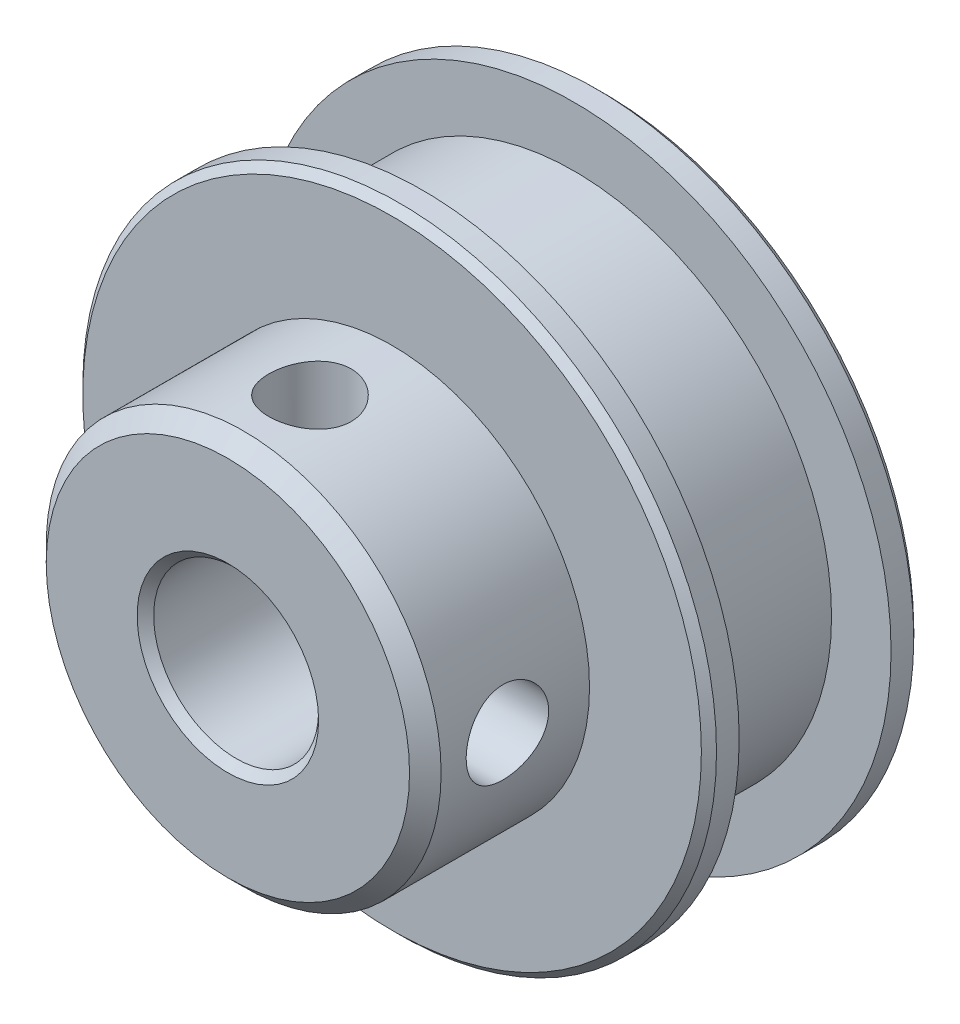
ISO-10303-21;
HEADER;
FILE_DESCRIPTION(('STEP AP214'),'2;1');
FILE_NAME('part.step','',(''),(''),'','','');
FILE_SCHEMA(('AUTOMOTIVE_DESIGN { 1 0 10303 214 1 1 1 1 }'));
ENDSEC;
DATA;
#1=APPLICATION_CONTEXT('core data for automotive mechanical design processes');
#2=APPLICATION_PROTOCOL_DEFINITION('international standard','automotive_design',2000,#1);
#3=PRODUCT_CONTEXT('',#1,'mechanical');
#4=PRODUCT('Part','Part','',(#3));
#5=PRODUCT_RELATED_PRODUCT_CATEGORY('part','',(#4));
#6=PRODUCT_DEFINITION_FORMATION('','',#4);
#7=PRODUCT_DEFINITION_CONTEXT('part definition',#1,'design');
#8=PRODUCT_DEFINITION('design','',#6,#7);
#9=PRODUCT_DEFINITION_SHAPE('','',#8);
#10=(LENGTH_UNIT() NAMED_UNIT(*) SI_UNIT(.MILLI.,.METRE.));
#11=(NAMED_UNIT(*) PLANE_ANGLE_UNIT() SI_UNIT($,.RADIAN.));
#12=(NAMED_UNIT(*) SI_UNIT($,.STERADIAN.) SOLID_ANGLE_UNIT());
#13=UNCERTAINTY_MEASURE_WITH_UNIT(LENGTH_MEASURE(1.E-05),#10,'distance_accuracy_value','');
#14=(GEOMETRIC_REPRESENTATION_CONTEXT(3) GLOBAL_UNCERTAINTY_ASSIGNED_CONTEXT((#13)) GLOBAL_UNIT_ASSIGNED_CONTEXT((#10,
#11,#12)) REPRESENTATION_CONTEXT('',''));
#15=CARTESIAN_POINT('',(0.,0.,0.));
#16=DIRECTION('',(0.,0.,1.));
#17=DIRECTION('',(1.,0.,0.));
#18=AXIS2_PLACEMENT_3D('',#15,#16,#17);
#19=CARTESIAN_POINT('',(0.,0.,8.833));
#20=DIRECTION('',(0.,0.,1.));
#21=DIRECTION('',(1.,0.,0.));
#22=AXIS2_PLACEMENT_3D('',#19,#20,#21);
#23=CYLINDRICAL_SURFACE('',#22,15.367);
#24=CARTESIAN_POINT('',(0.,0.,8.833));
#25=DIRECTION('',(0.,0.,1.));
#26=DIRECTION('',(1.,0.,0.));
#27=AXIS2_PLACEMENT_3D('',#24,#25,#26);
#28=CIRCLE('',#27,15.367);
#29=CARTESIAN_POINT('',(15.367,0.,8.833));
#30=VERTEX_POINT('',#29);
#31=EDGE_CURVE('E242',#30,#30,#28,.T.);
#32=ORIENTED_EDGE('',*,*,#31,.T.);
#33=DIRECTION('',(0.,0.,1.));
#34=VECTOR('',#33,1.);
#35=CARTESIAN_POINT('',(15.367,0.,8.833));
#36=LINE('',#35,#34);
#37=CARTESIAN_POINT('',(15.367,0.,9.93325));
#38=VERTEX_POINT('',#37);
#39=EDGE_CURVE('E11',#30,#38,#36,.T.);
#40=ORIENTED_EDGE('',*,*,#39,.T.);
#41=CARTESIAN_POINT('',(0.,0.,9.93325));
#42=DIRECTION('',(0.,0.,1.));
#43=DIRECTION('',(1.,0.,0.));
#44=AXIS2_PLACEMENT_3D('',#41,#42,#43);
#45=CIRCLE('',#44,15.367);
#46=EDGE_CURVE('E234',#38,#38,#45,.T.);
#47=ORIENTED_EDGE('',*,*,#46,.F.);
#48=ORIENTED_EDGE('',*,*,#39,.F.);
#49=EDGE_LOOP('',(#32,#40,#47,#48));
#50=FACE_BOUND('',#49,.T.);
#51=ADVANCED_FACE('F17',(#50),#23,.T.);
#52=CARTESIAN_POINT('',(0.,0.,9.93325));
#53=DIRECTION('',(0.,0.,-1.));
#54=DIRECTION('',(1.,0.,0.));
#55=AXIS2_PLACEMENT_3D('',#52,#53,#54);
#56=CONICAL_SURFACE('',#55,15.367,0.785398163397);
#57=ORIENTED_EDGE('',*,*,#46,.T.);
#58=DIRECTION('',(-0.707106781186548,0.,0.707106781186548));
#59=VECTOR('',#58,1.);
#60=CARTESIAN_POINT('',(15.367,0.,9.93325));
#61=LINE('',#60,#59);
#62=CARTESIAN_POINT('',(15.00025,0.,10.3));
#63=VERTEX_POINT('',#62);
#64=EDGE_CURVE('E25',#38,#63,#61,.T.);
#65=ORIENTED_EDGE('',*,*,#64,.T.);
#66=CARTESIAN_POINT('',(0.,0.,10.3));
#67=DIRECTION('',(0.,0.,1.));
#68=DIRECTION('',(1.,0.,0.));
#69=AXIS2_PLACEMENT_3D('',#66,#67,#68);
#70=CIRCLE('',#69,15.00025);
#71=EDGE_CURVE('E263',#63,#63,#70,.T.);
#72=ORIENTED_EDGE('',*,*,#71,.F.);
#73=ORIENTED_EDGE('',*,*,#64,.F.);
#74=EDGE_LOOP('',(#57,#65,#72,#73));
#75=FACE_BOUND('',#74,.T.);
#76=ADVANCED_FACE('F274',(#75),#56,.T.);
#77=CARTESIAN_POINT('',(0.,0.,8.833));
#78=DIRECTION('',(0.,0.,1.));
#79=DIRECTION('',(1.,0.,0.));
#80=AXIS2_PLACEMENT_3D('',#77,#78,#79);
#81=PLANE('',#80);
#82=ORIENTED_EDGE('',*,*,#31,.F.);
#83=EDGE_LOOP('',(#82));
#84=FACE_BOUND('',#83,.T.);
#85=CARTESIAN_POINT('',(0.,0.,8.833));
#86=DIRECTION('',(0.,0.,1.));
#87=DIRECTION('',(1.,0.,0.));
#88=AXIS2_PLACEMENT_3D('',#85,#86,#87);
#89=CIRCLE('',#88,12.48);
#90=CARTESIAN_POINT('',(12.48,0.,8.833));
#91=VERTEX_POINT('',#90);
#92=EDGE_CURVE('E257',#91,#91,#89,.T.);
#93=ORIENTED_EDGE('',*,*,#92,.T.);
#94=EDGE_LOOP('',(#93));
#95=FACE_BOUND('',#94,.T.);
#96=ADVANCED_FACE('F270',(#84,#95),#81,.F.);
#97=CARTESIAN_POINT('',(0.,0.,10.3));
#98=DIRECTION('',(0.,0.,1.));
#99=DIRECTION('',(1.,0.,0.));
#100=AXIS2_PLACEMENT_3D('',#97,#98,#99);
#101=PLANE('',#100);
#102=CARTESIAN_POINT('',(0.,0.,10.3));
#103=DIRECTION('',(0.,0.,1.));
#104=DIRECTION('',(1.,0.,0.));
#105=AXIS2_PLACEMENT_3D('',#102,#103,#104);
#106=CIRCLE('',#105,9.5758);
#107=CARTESIAN_POINT('',(9.5758,0.,10.3));
#108=VERTEX_POINT('',#107);
#109=EDGE_CURVE('E228',#108,#108,#106,.T.);
#110=ORIENTED_EDGE('',*,*,#109,.F.);
#111=EDGE_LOOP('',(#110));
#112=FACE_BOUND('',#111,.T.);
#113=ORIENTED_EDGE('',*,*,#71,.T.);
#114=EDGE_LOOP('',(#113));
#115=FACE_BOUND('',#114,.T.);
#116=ADVANCED_FACE('F273',(#112,#115),#101,.T.);
#117=CARTESIAN_POINT('',(0.,0.,17.496536));
#118=DIRECTION('',(0.,0.,-1.));
#119=DIRECTION('',(1.,0.,0.));
#120=AXIS2_PLACEMENT_3D('',#117,#118,#119);
#121=CONICAL_SURFACE('',#120,9.5758,0.785398163397);
#122=CARTESIAN_POINT('',(0.,0.,17.496536));
#123=DIRECTION('',(0.,0.,1.));
#124=DIRECTION('',(1.,0.,0.));
#125=AXIS2_PLACEMENT_3D('',#122,#123,#124);
#126=CIRCLE('',#125,9.5758);
#127=CARTESIAN_POINT('',(9.5758,0.,17.496536));
#128=VERTEX_POINT('',#127);
#129=EDGE_CURVE('E249',#128,#128,#126,.T.);
#130=ORIENTED_EDGE('',*,*,#129,.T.);
#131=DIRECTION('',(-0.707106781186548,0.,0.707106781186548));
#132=VECTOR('',#131,1.);
#133=CARTESIAN_POINT('',(9.5758,0.,17.496536));
#134=LINE('',#133,#132);
#135=CARTESIAN_POINT('',(8.809736,0.,18.2626));
#136=VERTEX_POINT('',#135);
#137=EDGE_CURVE('E260',#128,#136,#134,.T.);
#138=ORIENTED_EDGE('',*,*,#137,.T.);
#139=CARTESIAN_POINT('',(0.,0.,18.2626));
#140=DIRECTION('',(0.,0.,1.));
#141=DIRECTION('',(1.,0.,0.));
#142=AXIS2_PLACEMENT_3D('',#139,#140,#141);
#143=CIRCLE('',#142,8.809736);
#144=EDGE_CURVE('E221',#136,#136,#143,.T.);
#145=ORIENTED_EDGE('',*,*,#144,.F.);
#146=ORIENTED_EDGE('',*,*,#137,.F.);
#147=EDGE_LOOP('',(#130,#138,#145,#146));
#148=FACE_BOUND('',#147,.T.);
#149=ADVANCED_FACE('F322',(#148),#121,.T.);
#150=CARTESIAN_POINT('',(0.,0.,1.467));
#151=DIRECTION('',(0.,0.,1.));
#152=DIRECTION('',(1.,0.,0.));
#153=AXIS2_PLACEMENT_3D('',#150,#151,#152);
#154=CYLINDRICAL_SURFACE('',#153,12.48);
#155=CARTESIAN_POINT('',(0.,0.,1.467));
#156=DIRECTION('',(0.,0.,1.));
#157=DIRECTION('',(1.,0.,0.));
#158=AXIS2_PLACEMENT_3D('',#155,#156,#157);
#159=CIRCLE('',#158,12.48);
#160=CARTESIAN_POINT('',(12.48,0.,1.467));
#161=VERTEX_POINT('',#160);
#162=EDGE_CURVE('E220',#161,#161,#159,.T.);
#163=ORIENTED_EDGE('',*,*,#162,.T.);
#164=DIRECTION('',(0.,0.,1.));
#165=VECTOR('',#164,1.);
#166=CARTESIAN_POINT('',(12.48,0.,1.467));
#167=LINE('',#166,#165);
#168=EDGE_CURVE('E253',#161,#91,#167,.T.);
#169=ORIENTED_EDGE('',*,*,#168,.T.);
#170=ORIENTED_EDGE('',*,*,#92,.F.);
#171=ORIENTED_EDGE('',*,*,#168,.F.);
#172=EDGE_LOOP('',(#163,#169,#170,#171));
#173=FACE_BOUND('',#172,.T.);
#174=ADVANCED_FACE('F278',(#173),#154,.T.);
#175=CARTESIAN_POINT('',(0.,0.,10.3));
#176=DIRECTION('',(0.,0.,1.));
#177=DIRECTION('',(1.,0.,0.));
#178=AXIS2_PLACEMENT_3D('',#175,#176,#177);
#179=CYLINDRICAL_SURFACE('',#178,9.5758);
#180=CARTESIAN_POINT('',(0.,9.5758,12.2813));
#181=CARTESIAN_POINT('',(-0.222799582031,9.5758,12.2813));
#182=CARTESIAN_POINT('',(-0.440768386329,9.569875379982,12.309665240298));
#183=CARTESIAN_POINT('',(-0.649799063763,9.558476977118,12.364244769283));
#184=CARTESIAN_POINT('',(-0.8462920697,9.542628469812,12.442271710147));
#185=CARTESIAN_POINT('',(-1.027225131083,9.523770897491,12.540367485175));
#186=CARTESIAN_POINT('',(-1.190276780029,9.503495247159,12.654543949357));
#187=CARTESIAN_POINT('',(-1.333986903029,9.483256448378,12.780212069891));
#188=CARTESIAN_POINT('',(-1.596661351703,9.442791919154,13.059931946946));
#189=CARTESIAN_POINT('',(-1.713896650379,9.422352957718,13.219055245055));
#190=CARTESIAN_POINT('',(-1.810313107623,9.404010644275,13.386503800854));
#191=CARTESIAN_POINT('',(-1.88660848886,9.388605245969,13.559948355919));
#192=CARTESIAN_POINT('',(-1.943392718326,9.376701043776,13.737561914356));
#193=CARTESIAN_POINT('',(-1.981113549325,9.368644898065,13.917845794328));
#194=CARTESIAN_POINT('',(-2.,9.364611344845,14.099498022237));
#195=CARTESIAN_POINT('',(-2.,9.364611344845,14.490853717853));
#196=CARTESIAN_POINT('',(-1.974906749921,9.369970270036,14.700093830439));
#197=CARTESIAN_POINT('',(-1.924853283166,9.38066109943,14.907246828775));
#198=CARTESIAN_POINT('',(-1.849392248764,9.396382333324,15.110392582594));
#199=CARTESIAN_POINT('',(-1.747706921418,9.416534854692,15.307134581692));
#200=CARTESIAN_POINT('',(-1.61873582315,9.440099920173,15.494380669891));
#201=CARTESIAN_POINT('',(-1.461365747784,9.465504339452,15.668025568423));
#202=CARTESIAN_POINT('',(-1.114354083291,9.512117729023,15.955098583383));
#203=CARTESIAN_POINT('',(-0.926111267086,9.534246170264,16.078651132275));
#204=CARTESIAN_POINT('',(-0.712981476369,9.554677909884,16.18222517426));
#205=CARTESIAN_POINT('',(-0.480193420986,9.57071567047,16.257883990361));
#206=CARTESIAN_POINT('',(-0.23480163296,9.579953784376,16.30042852994));
#207=CARTESIAN_POINT('',(0.01524822468509,9.581300303878,16.307357648552));
#208=CARTESIAN_POINT('',(0.2618049719,9.57512660024,16.278951651124));
#209=CARTESIAN_POINT('',(0.649534750578,9.554960178517,16.179399564344));
#210=CARTESIAN_POINT('',(0.798173532434,9.544455004682,16.126676302594));
#211=CARTESIAN_POINT('',(0.941862845121,9.531648124133,16.060670317993));
#212=CARTESIAN_POINT('',(1.079233883701,9.516962285975,15.981925298476));
#213=CARTESIAN_POINT('',(1.20898793161,9.500931446326,15.891152738601));
#214=CARTESIAN_POINT('',(1.329912557943,9.484167148977,15.789225918672));
#215=CARTESIAN_POINT('',(1.440908393497,9.467313175871,15.677169963311));
#216=CARTESIAN_POINT('',(1.651144195955,9.433033275846,15.423038533517));
#217=CARTESIAN_POINT('',(1.748163490926,9.415708997772,15.279008245092));
#218=CARTESIAN_POINT('',(1.830769630029,9.399843108599,15.125610966288));
#219=CARTESIAN_POINT('',(1.897916002975,9.386231465582,14.964562889729));
#220=CARTESIAN_POINT('',(1.948815082687,9.375543545123,14.797691498313));
#221=CARTESIAN_POINT('',(1.982934751428,9.368255544049,14.626894887714));
#222=CARTESIAN_POINT('',(2.,9.364611344845,14.45411146166));
#223=CARTESIAN_POINT('',(2.,9.364611344845,14.099485982914));
#224=CARTESIAN_POINT('',(1.981111088062,9.36864541956,13.917832988332));
#225=CARTESIAN_POINT('',(1.943389266063,9.376701788903,13.737554129382));
#226=CARTESIAN_POINT('',(1.886606467916,9.388605615228,13.559946797144));
#227=CARTESIAN_POINT('',(1.810313770096,9.404010442461,13.386506441793));
#228=CARTESIAN_POINT('',(1.713899091017,9.422352521661,13.219058759581));
#229=CARTESIAN_POINT('',(1.596663124779,9.442791646015,13.05993383508));
#230=CARTESIAN_POINT('',(1.334032533458,9.483249419092,12.780260661363));
#231=CARTESIAN_POINT('',(1.190324781185,9.503489248097,12.654574889307));
#232=CARTESIAN_POINT('',(1.027237950305,9.523771179125,12.540360261473));
#233=CARTESIAN_POINT('',(0.846248487641,9.542635253176,12.442235409038));
#234=CARTESIAN_POINT('',(0.649701058963,9.558485760664,12.36420277693));
#235=CARTESIAN_POINT('',(0.440644250681,9.569880542629,12.309640504288));
#236=CARTESIAN_POINT('',(0.222702436913,9.5758,12.2813));
#237=CARTESIAN_POINT('',(0.,9.5758,12.2813));
#238=(BOUNDED_CURVE() B_SPLINE_CURVE(8,(#180,#181,#182,#183,#184,#185,#186,#187,#188,#189,#190,
#191,#192,#193,#194,#195,#196,#197,#198,#199,#200,#201,#202,#203,#204,#205,#206,#207,#208,#209,
#210,#211,#212,#213,#214,#215,#216,#217,#218,#219,#220,#221,#222,#223,#224,#225,#226,#227,#228,
#229,#230,#231,#232,#233,#234,#235,#236,#237),.UNSPECIFIED.,.T.,
.F.) B_SPLINE_CURVE_WITH_KNOTS((9,7,7,7,7,7,7,7,9),(0.,0.1316574941,0.279007353917,
0.448849900899,0.594995184306,0.689388692849,0.793210058442,0.90243996343,1.),
.UNSPECIFIED.) CURVE() GEOMETRIC_REPRESENTATION_ITEM() RATIONAL_B_SPLINE_CURVE((1.,1.,1.,1.,1.,
1.,1.,1.,1.,1.,1.,1.,1.,1.,1.,1.,1.,1.,1.,1.,1.,1.,1.,1.,1.,1.,1.,1.,1.,1.,1.,1.,1.,1.,1.,1.,1.,
1.,1.,1.,1.,1.,1.,1.,1.,1.,1.,1.,1.,1.,1.,1.,1.,1.,1.,1.,1.,1.)) REPRESENTATION_ITEM(''));
#239=CARTESIAN_POINT('',(0.,9.5758,12.2813));
#240=VERTEX_POINT('',#239);
#241=EDGE_CURVE('E215',#240,#240,#238,.T.);
#242=ORIENTED_EDGE('',*,*,#241,.F.);
#243=EDGE_LOOP('',(#242));
#244=FACE_BOUND('',#243,.T.);
#245=ORIENTED_EDGE('',*,*,#109,.T.);
#246=DIRECTION('',(0.,0.,1.));
#247=VECTOR('',#246,1.);
#248=CARTESIAN_POINT('',(9.5758,0.,10.3));
#249=LINE('',#248,#247);
#250=CARTESIAN_POINT('',(9.5758,0.,12.2813));
#251=VERTEX_POINT('',#250);
#252=EDGE_CURVE('E238',#108,#251,#249,.T.);
#253=ORIENTED_EDGE('',*,*,#252,.T.);
#254=CARTESIAN_POINT('',(9.5758,0.,16.2813));
#255=CARTESIAN_POINT('',(9.5758,-0.25462809375,16.2813));
#256=CARTESIAN_POINT('',(9.567900506643,-0.502815150522,16.243479679602));
#257=CARTESIAN_POINT('',(9.552822859403,-0.737989411708,16.171280561385));
#258=CARTESIAN_POINT('',(9.532434080222,-0.954594727692,16.069376018321));
#259=CARTESIAN_POINT('',(9.509332259605,-1.148275803401,15.943660008999));
#260=CARTESIAN_POINT('',(9.485984209822,-1.316279709913,15.801244175574));
#261=CARTESIAN_POINT('',(9.439739612924,-1.616475318934,15.481568321026));
#262=CARTESIAN_POINT('',(9.41655732746,-1.746371904932,15.297537449511));
#263=CARTESIAN_POINT('',(9.39648170321,-1.848682352433,15.103224896695));
#264=CARTESIAN_POINT('',(9.380728344405,-1.924536076107,14.902069728363));
#265=CARTESIAN_POINT('',(9.369990125821,-1.974814717408,14.696655508999));
#266=CARTESIAN_POINT('',(9.364611344845,-2.,14.489087624691));
#267=CARTESIAN_POINT('',(9.364611344845,-2.,14.073512551902));
#268=CARTESIAN_POINT('',(9.369990111131,-1.974814784082,13.865939800475));
#269=CARTESIAN_POINT('',(9.380728795566,-1.924533955252,13.660522726726));
#270=CARTESIAN_POINT('',(9.39648243489,-1.84867898058,13.459370867561));
#271=CARTESIAN_POINT('',(9.416557121746,-1.746371752624,13.265065732179));
#272=CARTESIAN_POINT('',(9.439738721406,-1.616481106199,13.081037841785));
#273=CARTESIAN_POINT('',(9.485976176352,-1.316331858975,12.761411357537));
#274=CARTESIAN_POINT('',(9.509326938679,-1.148322421922,12.618962733231));
#275=CARTESIAN_POINT('',(9.532437723392,-0.954587267335,12.493198778419));
#276=CARTESIAN_POINT('',(9.55283278296,-0.737909707948,12.391272039658));
#277=CARTESIAN_POINT('',(9.567907390172,-0.502686643989,12.31908733905));
#278=CARTESIAN_POINT('',(9.5758,-0.254517070758,12.2813));
#279=CARTESIAN_POINT('',(9.5758,0.,12.2813));
#280=(BOUNDED_CURVE() B_SPLINE_CURVE(7,(#254,#255,#256,#257,#258,#259,#260,#261,#262,#263,#264,
#265,#266,#267,#268,#269,#270,#271,#272,#273,#274,#275,#276,#277,#278,#279),.UNSPECIFIED.,.F.,
.F.) B_SPLINE_CURVE_WITH_KNOTS((8,6,6,6,8),(0.,0.235964694175,0.500047950926,0.76413098324,1.),
.UNSPECIFIED.) CURVE() GEOMETRIC_REPRESENTATION_ITEM() RATIONAL_B_SPLINE_CURVE((1.,1.,1.,1.,1.,
1.,1.,1.,1.,1.,1.,1.,1.,1.,1.,1.,1.,1.,1.,1.,1.,1.,1.,1.,1.,1.)) REPRESENTATION_ITEM(''));
#281=CARTESIAN_POINT('',(9.5758,0.,16.2813));
#282=VERTEX_POINT('',#281);
#283=EDGE_CURVE('E168',#282,#251,#280,.T.);
#284=ORIENTED_EDGE('',*,*,#283,.F.);
#285=DIRECTION('',(0.,0.,1.));
#286=VECTOR('',#285,1.);
#287=CARTESIAN_POINT('',(9.5758,0.,10.3));
#288=LINE('',#287,#286);
#289=EDGE_CURVE('E245',#282,#128,#288,.T.);
#290=ORIENTED_EDGE('',*,*,#289,.T.);
#291=ORIENTED_EDGE('',*,*,#129,.F.);
#292=ORIENTED_EDGE('',*,*,#289,.F.);
#293=CARTESIAN_POINT('',(9.5758,0.,12.2813));
#294=CARTESIAN_POINT('',(9.5758,0.25462809375,12.2813));
#295=CARTESIAN_POINT('',(9.567900506643,0.502815150522,12.319120320398));
#296=CARTESIAN_POINT('',(9.552822859403,0.737989411708,12.391319438615));
#297=CARTESIAN_POINT('',(9.532434080222,0.954594727692,12.493223981679));
#298=CARTESIAN_POINT('',(9.509332259605,1.148275803401,12.618939991001));
#299=CARTESIAN_POINT('',(9.485984209822,1.316279709913,12.761355824426));
#300=CARTESIAN_POINT('',(9.439739033565,1.616479079826,13.081035683918));
#301=CARTESIAN_POINT('',(9.416557599103,1.746369173897,13.265061765434));
#302=CARTESIAN_POINT('',(9.396482471379,1.848679467858,13.459369022106));
#303=CARTESIAN_POINT('',(9.380728020558,1.924537509861,13.660527689732));
#304=CARTESIAN_POINT('',(9.369989415806,1.974818065767,13.865952288727));
#305=CARTESIAN_POINT('',(9.364611344845,2.,14.073526311128));
#306=CARTESIAN_POINT('',(9.364611344845,2.,14.489087448098));
#307=CARTESIAN_POINT('',(9.369990111131,1.974814784082,14.696660199524));
#308=CARTESIAN_POINT('',(9.380728795566,1.924533955251,14.902077273275));
#309=CARTESIAN_POINT('',(9.39648243489,1.84867898058,15.103229132438));
#310=CARTESIAN_POINT('',(9.416557121746,1.746371752624,15.297534267821));
#311=CARTESIAN_POINT('',(9.439738721406,1.616481106199,15.481562158215));
#312=CARTESIAN_POINT('',(9.485979952093,1.316307348852,15.801214743093));
#313=CARTESIAN_POINT('',(9.509328787818,1.148304761129,15.943643446151));
#314=CARTESIAN_POINT('',(9.532435058586,0.954598620533,16.069384904863));
#315=CARTESIAN_POINT('',(9.552827887356,0.737953658769,16.171304698336));
#316=CARTESIAN_POINT('',(9.567904415849,0.502747395726,16.243498364754));
#317=CARTESIAN_POINT('',(9.5758,0.254565198733,16.2813));
#318=CARTESIAN_POINT('',(9.5758,0.,16.2813));
#319=(BOUNDED_CURVE() B_SPLINE_CURVE(7,(#293,#294,#295,#296,#297,#298,#299,#300,#301,#302,#303,
#304,#305,#306,#307,#308,#309,#310,#311,#312,#313,#314,#315,#316,#317,#318),.UNSPECIFIED.,.F.,
.F.) B_SPLINE_CURVE_WITH_KNOTS((8,6,6,6,8),(0.,0.235942872288,0.500007970852,0.764090556382,1.),
.UNSPECIFIED.) CURVE() GEOMETRIC_REPRESENTATION_ITEM() RATIONAL_B_SPLINE_CURVE((1.,1.,1.,1.,1.,
1.,1.,1.,1.,1.,1.,1.,1.,1.,1.,1.,1.,1.,1.,1.,1.,1.,1.,1.,1.,1.)) REPRESENTATION_ITEM(''));
#320=EDGE_CURVE('E167',#251,#282,#319,.T.);
#321=ORIENTED_EDGE('',*,*,#320,.F.);
#322=ORIENTED_EDGE('',*,*,#252,.F.);
#323=EDGE_LOOP('',(#245,#253,#284,#290,#291,#292,#321,#322));
#324=FACE_BOUND('',#323,.T.);
#325=ADVANCED_FACE('F335',(#244,#324),#179,.T.);
#326=CARTESIAN_POINT('',(0.,0.,18.2626));
#327=DIRECTION('',(0.,0.,1.));
#328=DIRECTION('',(1.,0.,0.));
#329=AXIS2_PLACEMENT_3D('',#326,#327,#328);
#330=PLANE('',#329);
#331=CARTESIAN_POINT('',(0.,0.,18.2626));
#332=DIRECTION('',(0.,0.,1.));
#333=DIRECTION('',(1.,0.,0.));
#334=AXIS2_PLACEMENT_3D('',#331,#332,#333);
#335=CIRCLE('',#334,4.4);
#336=CARTESIAN_POINT('',(4.4,0.,18.2626));
#337=VERTEX_POINT('',#336);
#338=EDGE_CURVE('E146',#337,#337,#335,.T.);
#339=ORIENTED_EDGE('',*,*,#338,.F.);
#340=EDGE_LOOP('',(#339));
#341=FACE_BOUND('',#340,.T.);
#342=ORIENTED_EDGE('',*,*,#144,.T.);
#343=EDGE_LOOP('',(#342));
#344=FACE_BOUND('',#343,.T.);
#345=ADVANCED_FACE('F285',(#341,#344),#330,.T.);
#346=CARTESIAN_POINT('',(0.,0.,1.467));
#347=DIRECTION('',(0.,0.,1.));
#348=DIRECTION('',(1.,0.,0.));
#349=AXIS2_PLACEMENT_3D('',#346,#347,#348);
#350=PLANE('',#349);
#351=ORIENTED_EDGE('',*,*,#162,.F.);
#352=EDGE_LOOP('',(#351));
#353=FACE_BOUND('',#352,.T.);
#354=CARTESIAN_POINT('',(0.,0.,1.467));
#355=DIRECTION('',(0.,0.,1.));
#356=DIRECTION('',(1.,0.,0.));
#357=AXIS2_PLACEMENT_3D('',#354,#355,#356);
#358=CIRCLE('',#357,15.367);
#359=CARTESIAN_POINT('',(15.367,0.,1.467));
#360=VERTEX_POINT('',#359);
#361=EDGE_CURVE('E149',#360,#360,#358,.T.);
#362=ORIENTED_EDGE('',*,*,#361,.T.);
#363=EDGE_LOOP('',(#362));
#364=FACE_BOUND('',#363,.T.);
#365=ADVANCED_FACE('F281',(#353,#364),#350,.T.);
#366=CARTESIAN_POINT('',(0.,2.,14.2813));
#367=DIRECTION('',(0.,1.,0.));
#368=DIRECTION('',(0.,0.,-1.));
#369=AXIS2_PLACEMENT_3D('',#366,#367,#368);
#370=CYLINDRICAL_SURFACE('',#369,2.);
#371=DIRECTION('',(0.,1.,0.));
#372=VECTOR('',#371,1.);
#373=CARTESIAN_POINT('',(0.,2.,12.2813));
#374=LINE('',#373,#372);
#375=CARTESIAN_POINT('',(0.,4.,12.2813));
#376=VERTEX_POINT('',#375);
#377=EDGE_CURVE('E208',#376,#240,#374,.T.);
#378=ORIENTED_EDGE('',*,*,#377,.F.);
#379=CARTESIAN_POINT('',(0.,4.,12.2813));
#380=CARTESIAN_POINT('',(-0.156176721292,4.,12.2813));
#381=CARTESIAN_POINT('',(-0.311224075361,3.992682528754,12.295934754391));
#382=CARTESIAN_POINT('',(-0.46267088989,3.978246840095,12.324807058718));
#383=CARTESIAN_POINT('',(-0.608121293493,3.957557657202,12.366785348669));
#384=CARTESIAN_POINT('',(-0.745408195631,3.932097816841,12.420010955014));
#385=CARTESIAN_POINT('',(-0.926771902398,3.891549566716,12.507970198702));
#386=CARTESIAN_POINT('',(-0.979206158942,3.87888448582,12.535803933013));
#387=CARTESIAN_POINT('',(-1.03003563866,3.86572725883,12.565155933265));
#388=CARTESIAN_POINT('',(-1.079247859016,3.852169796435,12.59591645701));
#389=CARTESIAN_POINT('',(-1.126835448207,3.838300786797,12.6279817309));
#390=CARTESIAN_POINT('',(-1.233266920481,3.805660696189,12.705030417547));
#391=CARTESIAN_POINT('',(-1.290930751106,3.786721169465,12.750902852188));
#392=CARTESIAN_POINT('',(-1.345818431062,3.767568756457,12.798677442849));
#393=CARTESIAN_POINT('',(-1.397963938304,3.748371637123,12.848185262813));
#394=CARTESIAN_POINT('',(-1.447403240762,3.729284917305,12.899281794003));
#395=CARTESIAN_POINT('',(-1.549685212334,3.68809667088,13.014236521715));
#396=CARTESIAN_POINT('',(-1.601444706467,3.666095288603,13.078703824208));
#397=CARTESIAN_POINT('',(-1.649500722813,3.644689075403,13.145038225889));
#398=CARTESIAN_POINT('',(-1.693894828461,3.624101025554,13.213059118157));
#399=CARTESIAN_POINT('',(-1.734659473908,3.604535222392,13.282614302977));
#400=CARTESIAN_POINT('',(-1.807936999952,3.568331119578,13.42256403901));
#401=CARTESIAN_POINT('',(-1.840650027971,3.551625494589,13.492884521438));
#402=CARTESIAN_POINT('',(-1.86995013618,3.536242963656,13.564380133491));
#403=CARTESIAN_POINT('',(-1.895832761287,3.522346379585,13.636902703093));
#404=CARTESIAN_POINT('',(-1.91829114525,3.510075756412,13.710315565833));
#405=CARTESIAN_POINT('',(-1.95815685129,3.488006499764,13.865773058983));
#406=CARTESIAN_POINT('',(-1.974873358228,3.478557623397,13.947966353547));
#407=CARTESIAN_POINT('',(-1.987430401234,3.471358963537,14.030839497927));
#408=CARTESIAN_POINT('',(-1.995809030031,3.466521114482,14.114165602681));
#409=CARTESIAN_POINT('',(-2.,3.464101615138,14.197724013668));
#410=CARTESIAN_POINT('',(-2.,3.464101615138,14.365368967732));
#411=CARTESIAN_POINT('',(-1.995759442471,3.466549738501,14.449419843659));
#412=CARTESIAN_POINT('',(-1.987281755685,3.471444793799,14.533234287515));
#413=CARTESIAN_POINT('',(-1.974576372348,3.478727875866,14.616587866362));
#414=CARTESIAN_POINT('',(-1.957662631271,3.488285815008,14.699249729713));
#415=CARTESIAN_POINT('',(-1.917052639357,3.510755889579,14.856638222088));
#416=CARTESIAN_POINT('',(-1.893955421135,3.52336523418,14.931493126843));
#417=CARTESIAN_POINT('',(-1.867294651091,3.537660870151,15.005414403428));
#418=CARTESIAN_POINT('',(-1.837077085272,3.55349321373,15.078257418972));
#419=CARTESIAN_POINT('',(-1.803306921129,3.57068816022,15.149864921657));
#420=CARTESIAN_POINT('',(-1.697058624595,3.62296754221,15.349737139887));
#421=CARTESIAN_POINT('',(-1.61605185398,3.660853748416,15.474558124598));
#422=CARTESIAN_POINT('',(-1.522827923709,3.701564681837,15.593820265982));
#423=CARTESIAN_POINT('',(-1.417047477052,3.743786049649,15.706529627155));
#424=CARTESIAN_POINT('',(-1.298308712412,3.785952200796,15.811264953201));
#425=CARTESIAN_POINT('',(-1.079640786644,3.852607857455,15.968238355268));
#426=CARTESIAN_POINT('',(-0.987060339639,3.878253418457,16.026289370423));
#427=CARTESIAN_POINT('',(-0.888710930595,3.90250471277,16.079375091005));
#428=CARTESIAN_POINT('',(-0.784806054132,3.924707870486,16.126702650548));
#429=CARTESIAN_POINT('',(-0.675645519189,3.944206693246,16.167464888916));
#430=CARTESIAN_POINT('',(-0.473039035266,3.972938262408,16.226743996689));
#431=CARTESIAN_POINT('',(-0.38154722963,3.98348763521,16.248187250993));
#432=CARTESIAN_POINT('',(-0.287797228679,3.991666566834,16.264634840642));
#433=CARTESIAN_POINT('',(-0.192477919107,3.997217983314,16.275735016223));
#434=CARTESIAN_POINT('',(-0.09630305921256,4.,16.2813));
#435=CARTESIAN_POINT('',(0.156176721292,4.,16.2813));
#436=CARTESIAN_POINT('',(0.311224075361,3.992682528754,16.266665245609));
#437=CARTESIAN_POINT('',(0.46267088989,3.978246840095,16.237792941282));
#438=CARTESIAN_POINT('',(0.608121293493,3.957557657202,16.195814651331));
#439=CARTESIAN_POINT('',(0.745408195631,3.932097816841,16.142589044986));
#440=CARTESIAN_POINT('',(0.967422413648,3.88246116018,16.034914786157));
#441=CARTESIAN_POINT('',(1.057164718773,3.859504142639,15.984008693208));
#442=CARTESIAN_POINT('',(1.141934361923,3.835260300503,15.928724020623));
#443=CARTESIAN_POINT('',(1.221729094282,3.810201702406,15.869598380466));
#444=CARTESIAN_POINT('',(1.296580640248,3.784761674709,15.807098458934));
#445=CARTESIAN_POINT('',(1.449963720697,3.729005611812,15.66356504066));
#446=CARTESIAN_POINT('',(1.526518006882,3.698662895045,15.581201972017));
#447=CARTESIAN_POINT('',(1.596338667457,3.66893767724,15.495143588662));
#448=CARTESIAN_POINT('',(1.65955468194,3.640391983286,15.405863435942));
#449=CARTESIAN_POINT('',(1.71626983512,3.613524153744,15.313729902301));
#450=CARTESIAN_POINT('',(1.803955611499,3.570361831921,15.148544706497));
#451=CARTESIAN_POINT('',(1.837799710149,3.553120816979,15.076637654777));
#452=CARTESIAN_POINT('',(1.868063524554,3.537255518394,15.003487491908));
#453=CARTESIAN_POINT('',(1.894742672378,3.522941890158,14.92925340754));
#454=CARTESIAN_POINT('',(1.917830222392,3.510330918702,14.854081816407));
#455=CARTESIAN_POINT('',(1.958156850694,3.488006500094,14.696826943342));
#456=CARTESIAN_POINT('',(1.974873358826,3.478557623071,14.614633645074));
#457=CARTESIAN_POINT('',(1.987430402652,3.471358962731,14.531760494717));
#458=CARTESIAN_POINT('',(1.995809031085,3.466521113865,14.448434385597));
#459=CARTESIAN_POINT('',(2.,3.464101615138,14.364875975776));
#460=CARTESIAN_POINT('',(2.,3.464101615138,14.19723103365));
#461=CARTESIAN_POINT('',(1.995759442617,3.466549738417,14.113180158757));
#462=CARTESIAN_POINT('',(1.987281756026,3.471444793602,14.029365715308));
#463=CARTESIAN_POINT('',(1.974576372837,3.478727875587,13.946012136236));
#464=CARTESIAN_POINT('',(1.957662631721,3.488285814759,13.863350272031));
#465=CARTESIAN_POINT('',(1.917513635409,3.510500814038,13.70774841884));
#466=CARTESIAN_POINT('',(1.895044042264,3.522770850751,13.634641691571));
#467=CARTESIAN_POINT('',(1.869176659549,3.53665135998,13.562421685336));
#468=CARTESIAN_POINT('',(1.839918079196,3.552003604218,13.491223415288));
#469=CARTESIAN_POINT('',(1.807272686535,3.568666412819,13.42119326616));
#470=CARTESIAN_POINT('',(1.70340472136,3.619963715508,13.223116609777));
#471=CARTESIAN_POINT('',(1.623604351999,3.657459376753,13.098507593063));
#472=CARTESIAN_POINT('',(1.531712038953,3.697824676407,12.979353270262));
#473=CARTESIAN_POINT('',(1.427399246094,3.739771260711,12.866621676694));
#474=CARTESIAN_POINT('',(1.310273824499,3.781766553438,12.761695298145));
#475=CARTESIAN_POINT('',(1.133117265712,3.836464204681,12.632232442354));
#476=CARTESIAN_POINT('',(1.084476112479,3.850725111907,12.599197090119));
#477=CARTESIAN_POINT('',(1.034125131828,3.864665445606,12.567526419669));
#478=CARTESIAN_POINT('',(0.982071710319,3.878189763933,12.537331871565));
#479=CARTESIAN_POINT('',(0.928328836428,3.891199018782,12.508731565196));
#480=CARTESIAN_POINT('',(0.745561780724,3.932069115306,12.420071058209));
#481=CARTESIAN_POINT('',(0.608251535738,3.957539204528,12.366822705889));
#482=CARTESIAN_POINT('',(0.462769935099,3.978237687533,12.324825365614));
#483=CARTESIAN_POINT('',(0.311288585619,3.992679671809,12.295940469162));
#484=CARTESIAN_POINT('',(0.15620721196,4.,12.2813));
#485=CARTESIAN_POINT('',(0.,4.,12.2813));
#486=(BOUNDED_CURVE() B_SPLINE_CURVE(6,(#379,#380,#381,#382,#383,#384,#385,#386,#387,#388,#389,
#390,#391,#392,#393,#394,#395,#396,#397,#398,#399,#400,#401,#402,#403,#404,#405,#406,#407,#408,
#409,#410,#411,#412,#413,#414,#415,#416,#417,#418,#419,#420,#421,#422,#423,#424,#425,#426,#427,
#428,#429,#430,#431,#432,#433,#434,#435,#436,#437,#438,#439,#440,#441,#442,#443,#444,#445,#446,
#447,#448,#449,#450,#451,#452,#453,#454,#455,#456,#457,#458,#459,#460,#461,#462,#463,#464,#465,
#466,#467,#468,#469,#470,#471,#472,#473,#474,#475,#476,#477,#478,#479,#480,#481,#482,#483,#484,
#485),.UNSPECIFIED.,.T.,.F.) B_SPLINE_CURVE_WITH_KNOTS((7,5,5,5,5,5,5,5,5,5,5,5,5,5,5,5,5,5,5,5,
5,7),(0.,0.06243624378827,0.08892309604742,0.123772012576,0.165134907797,0.205344066114,
0.249403266814,0.29372235516,0.33474642663,0.410522819332,0.460287054458,0.498946435066,
0.561641175607,0.608251257093,0.663820359472,0.705186769698,0.74944169464,0.793957666619,
0.834190881716,0.909952189119,0.937254076701,1.),
.UNSPECIFIED.) CURVE() GEOMETRIC_REPRESENTATION_ITEM() RATIONAL_B_SPLINE_CURVE((1.,1.,1.,1.,1.,
1.,1.,1.,1.,1.,1.,1.,1.,1.,1.,1.,1.,1.,1.,1.,1.,1.,1.,1.,1.,1.,1.,1.,1.,1.,1.,1.,1.,1.,1.,1.,1.,
1.,1.,1.,1.,1.,1.,1.,1.,1.,1.,1.,1.,1.,1.,1.,1.,1.,1.,1.,1.,1.,1.,1.,1.,1.,1.,1.,1.,1.,1.,1.,1.,
1.,1.,1.,1.,1.,1.,1.,1.,1.,1.,1.,1.,1.,1.,1.,1.,1.,1.,1.,1.,1.,1.,1.,1.,1.,1.,1.,1.,1.,1.,1.,1.,
1.,1.,1.,1.,1.,1.)) REPRESENTATION_ITEM(''));
#487=EDGE_CURVE('E142',#376,#376,#486,.T.);
#488=ORIENTED_EDGE('',*,*,#487,.F.);
#489=ORIENTED_EDGE('',*,*,#377,.T.);
#490=ORIENTED_EDGE('',*,*,#241,.T.);
#491=EDGE_LOOP('',(#378,#488,#489,#490));
#492=FACE_BOUND('',#491,.T.);
#493=ADVANCED_FACE('F284',(#492),#370,.F.);
#494=CARTESIAN_POINT('',(2.,0.,14.2813));
#495=DIRECTION('',(1.,0.,0.));
#496=DIRECTION('',(0.,0.,-1.));
#497=AXIS2_PLACEMENT_3D('',#494,#495,#496);
#498=CYLINDRICAL_SURFACE('',#497,2.);
#499=ORIENTED_EDGE('',*,*,#283,.T.);
#500=DIRECTION('',(1.,0.,0.));
#501=VECTOR('',#500,1.);
#502=CARTESIAN_POINT('',(2.,0.,12.2813));
#503=LINE('',#502,#501);
#504=CARTESIAN_POINT('',(4.,0.,12.2813));
#505=VERTEX_POINT('',#504);
#506=EDGE_CURVE('E163',#505,#251,#503,.T.);
#507=ORIENTED_EDGE('',*,*,#506,.F.);
#508=CARTESIAN_POINT('',(4.,0.,16.2813));
#509=CARTESIAN_POINT('',(4.,-0.156176721292,16.2813));
#510=CARTESIAN_POINT('',(3.992682528754,-0.311224075361,16.266665245609));
#511=CARTESIAN_POINT('',(3.978246840095,-0.46267088989,16.237792941282));
#512=CARTESIAN_POINT('',(3.957557657202,-0.608121293493,16.195814651331));
#513=CARTESIAN_POINT('',(3.932097816841,-0.745408195631,16.142589044986));
#514=CARTESIAN_POINT('',(3.891549565346,-0.926771908524,16.054629798327));
#515=CARTESIAN_POINT('',(3.878884486254,-0.979206158027,16.026796068084));
#516=CARTESIAN_POINT('',(3.865727260271,-1.030035633214,15.997444070012));
#517=CARTESIAN_POINT('',(3.852169796787,-1.07924785704,15.966683543685));
#518=CARTESIAN_POINT('',(3.838300785325,-1.126835453006,15.934618265626));
#519=CARTESIAN_POINT('',(3.805660696189,-1.233266920481,15.857569582453));
#520=CARTESIAN_POINT('',(3.786721169465,-1.290930751106,15.811697147812));
#521=CARTESIAN_POINT('',(3.767568756457,-1.345818431062,15.763922557151));
#522=CARTESIAN_POINT('',(3.748371637123,-1.397963938304,15.714414737187));
#523=CARTESIAN_POINT('',(3.729284917305,-1.447403240762,15.663318205997));
#524=CARTESIAN_POINT('',(3.68809667088,-1.549685212333,15.548363478285));
#525=CARTESIAN_POINT('',(3.666095288603,-1.601444706467,15.483896175792));
#526=CARTESIAN_POINT('',(3.644689075403,-1.649500722813,15.417561774111));
#527=CARTESIAN_POINT('',(3.624101025554,-1.693894828461,15.349540881843));
#528=CARTESIAN_POINT('',(3.604535222392,-1.734659473908,15.279985697023));
#529=CARTESIAN_POINT('',(3.568331119578,-1.807936999952,15.14003596099));
#530=CARTESIAN_POINT('',(3.551625494589,-1.840650027971,15.069715478562));
#531=CARTESIAN_POINT('',(3.536242963656,-1.86995013618,14.998219866509));
#532=CARTESIAN_POINT('',(3.522346379585,-1.895832761287,14.925697296907));
#533=CARTESIAN_POINT('',(3.510075756412,-1.91829114525,14.852284434167));
#534=CARTESIAN_POINT('',(3.488006499764,-1.95815685129,14.696826941017));
#535=CARTESIAN_POINT('',(3.478557623397,-1.974873358228,14.614633646454));
#536=CARTESIAN_POINT('',(3.471358963537,-1.987430401234,14.531760502073));
#537=CARTESIAN_POINT('',(3.466521114482,-1.995809030031,14.448434397319));
#538=CARTESIAN_POINT('',(3.464101615138,-2.,14.364875986332));
#539=CARTESIAN_POINT('',(3.464101615138,-2.,14.19723103365));
#540=CARTESIAN_POINT('',(3.466549738417,-1.995759442617,14.113180158757));
#541=CARTESIAN_POINT('',(3.471444793602,-1.987281756026,14.029365715308));
#542=CARTESIAN_POINT('',(3.478727875587,-1.974576372837,13.946012136236));
#543=CARTESIAN_POINT('',(3.488285814759,-1.957662631721,13.863350272031));
#544=CARTESIAN_POINT('',(3.510500814038,-1.917513635409,13.70774841884));
#545=CARTESIAN_POINT('',(3.522770850751,-1.895044042264,13.63464169157));
#546=CARTESIAN_POINT('',(3.53665135998,-1.869176659549,13.562421685336));
#547=CARTESIAN_POINT('',(3.552003604217,-1.839918079196,13.491223415288));
#548=CARTESIAN_POINT('',(3.568666412819,-1.807272686535,13.42119326616));
#549=CARTESIAN_POINT('',(3.61996371552,-1.703404721336,13.223116609731));
#550=CARTESIAN_POINT('',(3.657459376733,-1.62360435203,13.098507593145));
#551=CARTESIAN_POINT('',(3.697824676405,-1.531712038985,12.979353270239));
#552=CARTESIAN_POINT('',(3.739771260736,-1.427399246007,12.866621676643));
#553=CARTESIAN_POINT('',(3.781766553422,-1.31027382455,12.761695298183));
#554=CARTESIAN_POINT('',(3.836464206268,-1.133117260572,12.632232438597));
#555=CARTESIAN_POINT('',(3.850725111627,-1.084476114284,12.599197090633));
#556=CARTESIAN_POINT('',(3.86466544417,-1.034125137318,12.567526422926));
#557=CARTESIAN_POINT('',(3.878189763483,-0.982071711318,12.537331872698));
#558=CARTESIAN_POINT('',(3.891199020157,-0.928328830281,12.508731562214));
#559=CARTESIAN_POINT('',(3.932069115194,-0.745561781226,12.420071058453));
#560=CARTESIAN_POINT('',(3.957539204601,-0.6082515356,12.366822705718));
#561=CARTESIAN_POINT('',(3.978237687599,-0.462769934566,12.324825365494));
#562=CARTESIAN_POINT('',(3.992679671756,-0.311288585486,12.295940469263));
#563=CARTESIAN_POINT('',(4.,-0.156207212506,12.2813));
#564=CARTESIAN_POINT('',(4.,0.,12.2813));
#565=(BOUNDED_CURVE() B_SPLINE_CURVE(6,(#508,#509,#510,#511,#512,#513,#514,#515,#516,#517,#518,
#519,#520,#521,#522,#523,#524,#525,#526,#527,#528,#529,#530,#531,#532,#533,#534,#535,#536,#537,
#538,#539,#540,#541,#542,#543,#544,#545,#546,#547,#548,#549,#550,#551,#552,#553,#554,#555,#556,
#557,#558,#559,#560,#561,#562,#563,#564),.UNSPECIFIED.,.F.,.F.) B_SPLINE_CURVE_WITH_KNOTS((7,5,
5,5,5,5,5,5,5,5,5,7),(0.,0.125159474077,0.178254930715,0.248112961087,0.331028893015,
0.411632047511,0.499952985068,0.588794891138,0.669089566459,0.820288757653,0.874775987514,1.),
.UNSPECIFIED.) CURVE() GEOMETRIC_REPRESENTATION_ITEM() RATIONAL_B_SPLINE_CURVE((1.,1.,1.,1.,1.,
1.,1.,1.,1.,1.,1.,1.,1.,1.,1.,1.,1.,1.,1.,1.,1.,1.,1.,1.,1.,1.,1.,1.,1.,1.,1.,1.,1.,1.,1.,1.,1.,
1.,1.,1.,1.,1.,1.,1.,1.,1.,1.,1.,1.,1.,1.,1.,1.,1.,1.,1.,1.)) REPRESENTATION_ITEM(''));
#566=CARTESIAN_POINT('',(4.,0.,16.2813));
#567=VERTEX_POINT('',#566);
#568=EDGE_CURVE('E180',#567,#505,#565,.T.);
#569=ORIENTED_EDGE('',*,*,#568,.F.);
#570=CARTESIAN_POINT('',(4.,0.,12.2813));
#571=CARTESIAN_POINT('',(4.,0.156176721292,12.2813));
#572=CARTESIAN_POINT('',(3.992682528754,0.311224075361,12.295934754391));
#573=CARTESIAN_POINT('',(3.978246840095,0.46267088989,12.324807058718));
#574=CARTESIAN_POINT('',(3.957557657202,0.608121293493,12.366785348669));
#575=CARTESIAN_POINT('',(3.932097816841,0.745408195631,12.420010955014));
#576=CARTESIAN_POINT('',(3.891549565381,0.926771908367,12.507970201596));
#577=CARTESIAN_POINT('',(3.878884486242,0.979206158051,12.535803931944));
#578=CARTESIAN_POINT('',(3.865727260234,1.030035633354,12.565155930072));
#579=CARTESIAN_POINT('',(3.852169796778,1.079247857091,12.595916456333));
#580=CARTESIAN_POINT('',(3.838300785363,1.126835452882,12.627981734285));
#581=CARTESIAN_POINT('',(3.805660696189,1.233266920481,12.705030417547));
#582=CARTESIAN_POINT('',(3.786721169465,1.290930751106,12.750902852188));
#583=CARTESIAN_POINT('',(3.767568756457,1.345818431062,12.798677442849));
#584=CARTESIAN_POINT('',(3.748371637123,1.397963938304,12.848185262813));
#585=CARTESIAN_POINT('',(3.729284917305,1.447403240762,12.899281794003));
#586=CARTESIAN_POINT('',(3.68809667088,1.549685212333,13.014236521715));
#587=CARTESIAN_POINT('',(3.666095288603,1.601444706467,13.078703824208));
#588=CARTESIAN_POINT('',(3.644689075403,1.649500722813,13.145038225889));
#589=CARTESIAN_POINT('',(3.624101025554,1.693894828461,13.213059118157));
#590=CARTESIAN_POINT('',(3.604535222392,1.734659473908,13.282614302977));
#591=CARTESIAN_POINT('',(3.568331119578,1.807936999952,13.42256403901));
#592=CARTESIAN_POINT('',(3.551625494589,1.840650027971,13.492884521438));
#593=CARTESIAN_POINT('',(3.536242963656,1.86995013618,13.564380133491));
#594=CARTESIAN_POINT('',(3.522346379585,1.895832761287,13.636902703093));
#595=CARTESIAN_POINT('',(3.510075756412,1.91829114525,13.710315565833));
#596=CARTESIAN_POINT('',(3.488006499764,1.95815685129,13.865773058983));
#597=CARTESIAN_POINT('',(3.478557623397,1.974873358228,13.947966353546));
#598=CARTESIAN_POINT('',(3.471358963537,1.987430401234,14.030839497927));
#599=CARTESIAN_POINT('',(3.466521114482,1.995809030031,14.114165602681));
#600=CARTESIAN_POINT('',(3.464101615138,2.,14.197724013668));
#601=CARTESIAN_POINT('',(3.464101615138,2.,14.36536896635));
#602=CARTESIAN_POINT('',(3.466549738417,1.995759442617,14.449419841243));
#603=CARTESIAN_POINT('',(3.471444793602,1.987281756026,14.533234284692));
#604=CARTESIAN_POINT('',(3.478727875587,1.974576372837,14.616587863764));
#605=CARTESIAN_POINT('',(3.488285814759,1.957662631721,14.699249727969));
#606=CARTESIAN_POINT('',(3.510500814038,1.917513635409,14.85485158116));
#607=CARTESIAN_POINT('',(3.522770850751,1.895044042264,14.92795830843));
#608=CARTESIAN_POINT('',(3.53665135998,1.869176659549,15.000178314664));
#609=CARTESIAN_POINT('',(3.552003604218,1.839918079196,15.071376584712));
#610=CARTESIAN_POINT('',(3.568666412819,1.807272686535,15.14140673384));
#611=CARTESIAN_POINT('',(3.61996371552,1.703404721336,15.339483390269));
#612=CARTESIAN_POINT('',(3.657459376733,1.62360435203,15.464092406855));
#613=CARTESIAN_POINT('',(3.697824676405,1.531712038985,15.583246729761));
#614=CARTESIAN_POINT('',(3.739771260736,1.427399246007,15.695978323357));
#615=CARTESIAN_POINT('',(3.781766553422,1.31027382455,15.800904701817));
#616=CARTESIAN_POINT('',(3.836464204633,1.133117265867,15.930367557533));
#617=CARTESIAN_POINT('',(3.850725111915,1.084476112425,15.963402909897));
#618=CARTESIAN_POINT('',(3.864665445649,1.034125131663,15.995073580429));
#619=CARTESIAN_POINT('',(3.878189763946,0.982071710289,16.025268128469));
#620=CARTESIAN_POINT('',(3.891199018741,0.928328836613,16.053868434714));
#621=CARTESIAN_POINT('',(3.932069115306,0.745561780724,16.142528941791));
#622=CARTESIAN_POINT('',(3.957539204528,0.608251535739,16.195777294111));
#623=CARTESIAN_POINT('',(3.978237687533,0.462769935098,16.237774634386));
#624=CARTESIAN_POINT('',(3.992679671809,0.311288585619,16.266659530838));
#625=CARTESIAN_POINT('',(4.,0.15620721196,16.2813));
#626=CARTESIAN_POINT('',(4.,0.,16.2813));
#627=(BOUNDED_CURVE() B_SPLINE_CURVE(6,(#570,#571,#572,#573,#574,#575,#576,#577,#578,#579,#580,
#581,#582,#583,#584,#585,#586,#587,#588,#589,#590,#591,#592,#593,#594,#595,#596,#597,#598,#599,
#600,#601,#602,#603,#604,#605,#606,#607,#608,#609,#610,#611,#612,#613,#614,#615,#616,#617,#618,
#619,#620,#621,#622,#623,#624,#625,#626),.UNSPECIFIED.,.F.,.F.) B_SPLINE_CURVE_WITH_KNOTS((7,5,
5,5,5,5,5,5,5,5,5,7),(0.,0.12515947894,0.178254937486,0.248112970181,0.331028904865,
0.411632062041,0.499953002535,0.588794911559,0.66908958955,0.820288785772,0.874776011296,1.),
.UNSPECIFIED.) CURVE() GEOMETRIC_REPRESENTATION_ITEM() RATIONAL_B_SPLINE_CURVE((1.,1.,1.,1.,1.,
1.,1.,1.,1.,1.,1.,1.,1.,1.,1.,1.,1.,1.,1.,1.,1.,1.,1.,1.,1.,1.,1.,1.,1.,1.,1.,1.,1.,1.,1.,1.,1.,
1.,1.,1.,1.,1.,1.,1.,1.,1.,1.,1.,1.,1.,1.,1.,1.,1.,1.,1.,1.)) REPRESENTATION_ITEM(''));
#628=EDGE_CURVE('E192',#505,#567,#627,.T.);
#629=ORIENTED_EDGE('',*,*,#628,.F.);
#630=ORIENTED_EDGE('',*,*,#506,.T.);
#631=ORIENTED_EDGE('',*,*,#320,.T.);
#632=EDGE_LOOP('',(#499,#507,#569,#629,#630,#631));
#633=FACE_BOUND('',#632,.T.);
#634=ADVANCED_FACE('F316',(#633),#498,.F.);
#635=CARTESIAN_POINT('',(0.,0.,18.2626));
#636=DIRECTION('',(0.,0.,1.));
#637=DIRECTION('',(1.,0.,0.));
#638=AXIS2_PLACEMENT_3D('',#635,#636,#637);
#639=CONICAL_SURFACE('',#638,4.4,0.785398163397);
#640=ORIENTED_EDGE('',*,*,#338,.T.);
#641=DIRECTION('',(-0.707106781186548,0.,-0.707106781186548));
#642=VECTOR('',#641,1.);
#643=CARTESIAN_POINT('',(4.4,0.,18.2626));
#644=LINE('',#643,#642);
#645=CARTESIAN_POINT('',(4.,0.,17.8626));
#646=VERTEX_POINT('',#645);
#647=EDGE_CURVE('E148',#337,#646,#644,.T.);
#648=ORIENTED_EDGE('',*,*,#647,.T.);
#649=CARTESIAN_POINT('',(0.,0.,17.8626));
#650=DIRECTION('',(0.,0.,1.));
#651=DIRECTION('',(1.,0.,0.));
#652=AXIS2_PLACEMENT_3D('',#649,#650,#651);
#653=CIRCLE('',#652,4.);
#654=EDGE_CURVE('E172',#646,#646,#653,.T.);
#655=ORIENTED_EDGE('',*,*,#654,.F.);
#656=ORIENTED_EDGE('',*,*,#647,.F.);
#657=EDGE_LOOP('',(#640,#648,#655,#656));
#658=FACE_BOUND('',#657,.T.);
#659=ADVANCED_FACE('F327',(#658),#639,.F.);
#660=CARTESIAN_POINT('',(0.,0.,0.36675));
#661=DIRECTION('',(0.,0.,1.));
#662=DIRECTION('',(1.,0.,0.));
#663=AXIS2_PLACEMENT_3D('',#660,#661,#662);
#664=CYLINDRICAL_SURFACE('',#663,15.367);
#665=CARTESIAN_POINT('',(0.,0.,0.36675));
#666=DIRECTION('',(0.,0.,1.));
#667=DIRECTION('',(1.,0.,0.));
#668=AXIS2_PLACEMENT_3D('',#665,#666,#667);
#669=CIRCLE('',#668,15.367);
#670=CARTESIAN_POINT('',(15.367,0.,0.36675));
#671=VERTEX_POINT('',#670);
#672=EDGE_CURVE('E162',#671,#671,#669,.T.);
#673=ORIENTED_EDGE('',*,*,#672,.T.);
#674=DIRECTION('',(0.,0.,1.));
#675=VECTOR('',#674,1.);
#676=CARTESIAN_POINT('',(15.367,0.,0.36675));
#677=LINE('',#676,#675);
#678=EDGE_CURVE('E153',#671,#360,#677,.T.);
#679=ORIENTED_EDGE('',*,*,#678,.T.);
#680=ORIENTED_EDGE('',*,*,#361,.F.);
#681=ORIENTED_EDGE('',*,*,#678,.F.);
#682=EDGE_LOOP('',(#673,#679,#680,#681));
#683=FACE_BOUND('',#682,.T.);
#684=ADVANCED_FACE('F289',(#683),#664,.T.);
#685=CARTESIAN_POINT('',(0.,0.,17.8626));
#686=DIRECTION('',(0.,0.,-1.));
#687=DIRECTION('',(1.,0.,0.));
#688=AXIS2_PLACEMENT_3D('',#685,#686,#687);
#689=CYLINDRICAL_SURFACE('',#688,4.);
#690=ORIENTED_EDGE('',*,*,#487,.T.);
#691=EDGE_LOOP('',(#690));
#692=FACE_BOUND('',#691,.T.);
#693=ORIENTED_EDGE('',*,*,#654,.T.);
#694=DIRECTION('',(0.,0.,-1.));
#695=VECTOR('',#694,1.);
#696=CARTESIAN_POINT('',(4.,0.,17.8626));
#697=LINE('',#696,#695);
#698=EDGE_CURVE('E176',#646,#567,#697,.T.);
#699=ORIENTED_EDGE('',*,*,#698,.T.);
#700=ORIENTED_EDGE('',*,*,#568,.T.);
#701=DIRECTION('',(0.,0.,-1.));
#702=VECTOR('',#701,1.);
#703=CARTESIAN_POINT('',(4.,0.,17.8626));
#704=LINE('',#703,#702);
#705=CARTESIAN_POINT('',(4.,0.,0.4));
#706=VERTEX_POINT('',#705);
#707=EDGE_CURVE('E186',#505,#706,#704,.T.);
#708=ORIENTED_EDGE('',*,*,#707,.T.);
#709=CARTESIAN_POINT('',(0.,0.,0.4));
#710=DIRECTION('',(0.,0.,1.));
#711=DIRECTION('',(1.,0.,0.));
#712=AXIS2_PLACEMENT_3D('',#709,#710,#711);
#713=CIRCLE('',#712,4.);
#714=EDGE_CURVE('E125',#706,#706,#713,.T.);
#715=ORIENTED_EDGE('',*,*,#714,.F.);
#716=ORIENTED_EDGE('',*,*,#707,.F.);
#717=ORIENTED_EDGE('',*,*,#628,.T.);
#718=ORIENTED_EDGE('',*,*,#698,.F.);
#719=EDGE_LOOP('',(#693,#699,#700,#708,#715,#716,#717,#718));
#720=FACE_BOUND('',#719,.T.);
#721=ADVANCED_FACE('F313',(#692,#720),#689,.F.);
#722=CARTESIAN_POINT('',(0.,0.,0.));
#723=DIRECTION('',(0.,0.,1.));
#724=DIRECTION('',(1.,0.,0.));
#725=AXIS2_PLACEMENT_3D('',#722,#723,#724);
#726=CONICAL_SURFACE('',#725,15.00025,0.785398163397);
#727=CARTESIAN_POINT('',(0.,0.,0.));
#728=DIRECTION('',(0.,0.,1.));
#729=DIRECTION('',(1.,0.,0.));
#730=AXIS2_PLACEMENT_3D('',#727,#728,#729);
#731=CIRCLE('',#730,15.00025);
#732=CARTESIAN_POINT('',(15.00025,0.,0.));
#733=VERTEX_POINT('',#732);
#734=EDGE_CURVE('E132',#733,#733,#731,.T.);
#735=ORIENTED_EDGE('',*,*,#734,.T.);
#736=DIRECTION('',(0.707106781186548,0.,0.707106781186548));
#737=VECTOR('',#736,1.);
#738=CARTESIAN_POINT('',(15.00025,0.,0.));
#739=LINE('',#738,#737);
#740=EDGE_CURVE('E127',#733,#671,#739,.T.);
#741=ORIENTED_EDGE('',*,*,#740,.T.);
#742=ORIENTED_EDGE('',*,*,#672,.F.);
#743=ORIENTED_EDGE('',*,*,#740,.F.);
#744=EDGE_LOOP('',(#735,#741,#742,#743));
#745=FACE_BOUND('',#744,.T.);
#746=ADVANCED_FACE('F292',(#745),#726,.T.);
#747=CARTESIAN_POINT('',(0.,0.,0.4));
#748=DIRECTION('',(0.,0.,-1.));
#749=DIRECTION('',(1.,0.,0.));
#750=AXIS2_PLACEMENT_3D('',#747,#748,#749);
#751=CONICAL_SURFACE('',#750,4.,0.785398163397);
#752=ORIENTED_EDGE('',*,*,#714,.T.);
#753=DIRECTION('',(0.707106781186548,0.,-0.707106781186548));
#754=VECTOR('',#753,1.);
#755=CARTESIAN_POINT('',(4.,0.,0.4));
#756=LINE('',#755,#754);
#757=CARTESIAN_POINT('',(4.4,0.,0.));
#758=VERTEX_POINT('',#757);
#759=EDGE_CURVE('E120',#706,#758,#756,.T.);
#760=ORIENTED_EDGE('',*,*,#759,.T.);
#761=CARTESIAN_POINT('',(0.,0.,0.));
#762=DIRECTION('',(0.,0.,1.));
#763=DIRECTION('',(1.,0.,0.));
#764=AXIS2_PLACEMENT_3D('',#761,#762,#763);
#765=CIRCLE('',#764,4.4);
#766=EDGE_CURVE('E123',#758,#758,#765,.T.);
#767=ORIENTED_EDGE('',*,*,#766,.F.);
#768=ORIENTED_EDGE('',*,*,#759,.F.);
#769=EDGE_LOOP('',(#752,#760,#767,#768));
#770=FACE_BOUND('',#769,.T.);
#771=ADVANCED_FACE('F122',(#770),#751,.F.);
#772=CARTESIAN_POINT('',(0.,0.,0.));
#773=DIRECTION('',(0.,0.,1.));
#774=DIRECTION('',(1.,0.,0.));
#775=AXIS2_PLACEMENT_3D('',#772,#773,#774);
#776=PLANE('',#775);
#777=ORIENTED_EDGE('',*,*,#734,.F.);
#778=EDGE_LOOP('',(#777));
#779=FACE_BOUND('',#778,.T.);
#780=ORIENTED_EDGE('',*,*,#766,.T.);
#781=EDGE_LOOP('',(#780));
#782=FACE_BOUND('',#781,.T.);
#783=ADVANCED_FACE('F130',(#779,#782),#776,.F.);
#784=CLOSED_SHELL('',(#51,#76,#96,#116,#149,#174,#325,#345,#365,#493,#634,#659,#684,#721,#746,
#771,#783));
#785=MANIFOLD_SOLID_BREP('B1',#784);
#786=ADVANCED_BREP_SHAPE_REPRESENTATION('',(#18,#785),#14);
#787=SHAPE_DEFINITION_REPRESENTATION(#9,#786);
ENDSEC;
END-ISO-10303-21;
